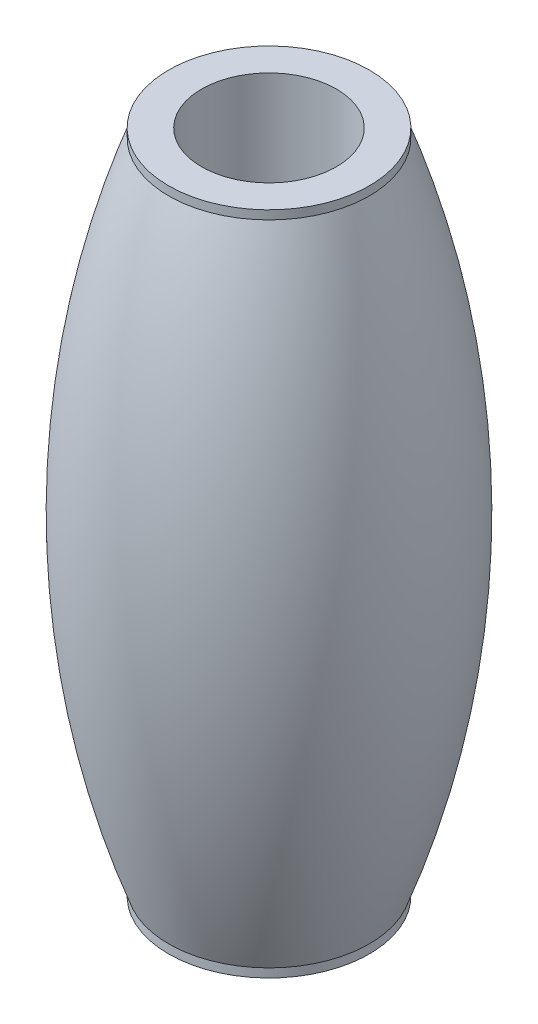
ISO-10303-21;
HEADER;
FILE_DESCRIPTION(('STEP AP214'),'2;1');
FILE_NAME('part.step','',(''),(''),'','','');
FILE_SCHEMA(('AUTOMOTIVE_DESIGN { 1 0 10303 214 1 1 1 1 }'));
ENDSEC;
DATA;
#1=APPLICATION_CONTEXT('core data for automotive mechanical design processes');
#2=APPLICATION_PROTOCOL_DEFINITION('international standard','automotive_design',2000,#1);
#3=PRODUCT_CONTEXT('',#1,'mechanical');
#4=PRODUCT('Part','Part','',(#3));
#5=PRODUCT_RELATED_PRODUCT_CATEGORY('part','',(#4));
#6=PRODUCT_DEFINITION_FORMATION('','',#4);
#7=PRODUCT_DEFINITION_CONTEXT('part definition',#1,'design');
#8=PRODUCT_DEFINITION('design','',#6,#7);
#9=PRODUCT_DEFINITION_SHAPE('','',#8);
#10=(LENGTH_UNIT() NAMED_UNIT(*) SI_UNIT(.MILLI.,.METRE.));
#11=(NAMED_UNIT(*) PLANE_ANGLE_UNIT() SI_UNIT($,.RADIAN.));
#12=(NAMED_UNIT(*) SI_UNIT($,.STERADIAN.) SOLID_ANGLE_UNIT());
#13=UNCERTAINTY_MEASURE_WITH_UNIT(LENGTH_MEASURE(1.E-05),#10,'distance_accuracy_value','');
#14=(GEOMETRIC_REPRESENTATION_CONTEXT(3) GLOBAL_UNCERTAINTY_ASSIGNED_CONTEXT((#13)) GLOBAL_UNIT_ASSIGNED_CONTEXT((#10,
#11,#12)) REPRESENTATION_CONTEXT('',''));
#15=CARTESIAN_POINT('',(0.,0.,0.));
#16=DIRECTION('',(0.,0.,1.));
#17=DIRECTION('',(1.,0.,0.));
#18=AXIS2_PLACEMENT_3D('',#15,#16,#17);
#19=CARTESIAN_POINT('',(22.5,0.,0.));
#20=DIRECTION('',(0.,-1.,0.));
#21=DIRECTION('',(0.,0.,-1.));
#22=AXIS2_PLACEMENT_3D('',#19,#20,#21);
#23=CYLINDRICAL_SURFACE('',#22,1.925);
#24=CARTESIAN_POINT('',(22.5,-9.5,0.));
#25=DIRECTION('',(0.,-1.,0.));
#26=DIRECTION('',(0.,0.,-1.));
#27=AXIS2_PLACEMENT_3D('',#24,#25,#26);
#28=CIRCLE('',#27,1.925);
#29=CARTESIAN_POINT('',(22.5,-9.5,-1.925));
#30=VERTEX_POINT('',#29);
#31=EDGE_CURVE('E32',#30,#30,#28,.F.);
#32=ORIENTED_EDGE('',*,*,#31,.F.);
#33=EDGE_LOOP('',(#32));
#34=FACE_BOUND('',#33,.T.);
#35=CARTESIAN_POINT('',(22.5,9.5,0.));
#36=DIRECTION('',(0.,-1.,0.));
#37=DIRECTION('',(0.,0.,-1.));
#38=AXIS2_PLACEMENT_3D('',#35,#36,#37);
#39=CIRCLE('',#38,1.925);
#40=CARTESIAN_POINT('',(22.5,9.5,-1.925));
#41=VERTEX_POINT('',#40);
#42=EDGE_CURVE('E29',#41,#41,#39,.F.);
#43=ORIENTED_EDGE('',*,*,#42,.T.);
#44=EDGE_LOOP('',(#43));
#45=FACE_BOUND('',#44,.T.);
#46=ADVANCED_FACE('F14',(#34,#45),#23,.F.);
#47=CARTESIAN_POINT('',(22.5,9.5,0.));
#48=DIRECTION('',(0.,-1.,0.));
#49=DIRECTION('',(0.,0.,-1.));
#50=AXIS2_PLACEMENT_3D('',#47,#48,#49);
#51=PLANE('',#50);
#52=ORIENTED_EDGE('',*,*,#42,.F.);
#53=EDGE_LOOP('',(#52));
#54=FACE_BOUND('',#53,.T.);
#55=CARTESIAN_POINT('',(22.5,9.5,0.));
#56=DIRECTION('',(0.,-1.,0.));
#57=DIRECTION('',(0.,0.,-1.));
#58=AXIS2_PLACEMENT_3D('',#55,#56,#57);
#59=CIRCLE('',#58,2.86606985719299);
#60=CARTESIAN_POINT('',(22.5,9.5,-2.86606985719299));
#61=VERTEX_POINT('',#60);
#62=EDGE_CURVE('E35',#61,#61,#59,.T.);
#63=ORIENTED_EDGE('',*,*,#62,.F.);
#64=EDGE_LOOP('',(#63));
#65=FACE_BOUND('',#64,.T.);
#66=ADVANCED_FACE('F46',(#54,#65),#51,.F.);
#67=CARTESIAN_POINT('',(22.5,-9.5,0.));
#68=DIRECTION('',(0.,-1.,0.));
#69=DIRECTION('',(0.,0.,-1.));
#70=AXIS2_PLACEMENT_3D('',#67,#68,#69);
#71=PLANE('',#70);
#72=ORIENTED_EDGE('',*,*,#31,.T.);
#73=EDGE_LOOP('',(#72));
#74=FACE_BOUND('',#73,.T.);
#75=CARTESIAN_POINT('',(22.5,-9.5,0.));
#76=DIRECTION('',(0.,-1.,0.));
#77=DIRECTION('',(0.,0.,-1.));
#78=AXIS2_PLACEMENT_3D('',#75,#76,#77);
#79=CIRCLE('',#78,2.86606985719299);
#80=CARTESIAN_POINT('',(22.5,-9.5,-2.86606985719299));
#81=VERTEX_POINT('',#80);
#82=EDGE_CURVE('E26',#81,#81,#79,.F.);
#83=ORIENTED_EDGE('',*,*,#82,.F.);
#84=EDGE_LOOP('',(#83));
#85=FACE_BOUND('',#84,.T.);
#86=ADVANCED_FACE('F43',(#74,#85),#71,.T.);
#87=CARTESIAN_POINT('',(22.5,0.,0.));
#88=DIRECTION('',(0.,-1.,0.));
#89=DIRECTION('',(0.,0.,-1.));
#90=AXIS2_PLACEMENT_3D('',#87,#88,#89);
#91=CYLINDRICAL_SURFACE('',#90,2.86606985719299);
#92=ORIENTED_EDGE('',*,*,#62,.T.);
#93=EDGE_LOOP('',(#92));
#94=FACE_BOUND('',#93,.T.);
#95=CARTESIAN_POINT('',(22.5,9.25000000000118,-5.95437354078146E-12));
#96=DIRECTION('',(0.,1.,0.));
#97=DIRECTION('',(-1.,0.,0.));
#98=AXIS2_PLACEMENT_3D('',#95,#96,#97);
#99=CIRCLE('',#98,2.86606985719079);
#100=CARTESIAN_POINT('',(19.6339301428092,9.25000000000118,-5.95430875027252E-12));
#101=VERTEX_POINT('',#100);
#102=EDGE_CURVE('E10',#101,#101,#99,.T.);
#103=ORIENTED_EDGE('',*,*,#102,.T.);
#104=EDGE_LOOP('',(#103));
#105=FACE_BOUND('',#104,.T.);
#106=ADVANCED_FACE('F45',(#94,#105),#91,.T.);
#107=CARTESIAN_POINT('',(22.5,0.,0.));
#108=DIRECTION('',(0.,-1.,0.));
#109=DIRECTION('',(0.,0.,-1.));
#110=AXIS2_PLACEMENT_3D('',#107,#108,#109);
#111=CYLINDRICAL_SURFACE('',#110,2.86606985719299);
#112=CARTESIAN_POINT('',(22.5,-9.2500000000012,-5.9935344000088E-12));
#113=DIRECTION('',(0.,-1.,0.));
#114=DIRECTION('',(-1.,0.,0.));
#115=AXIS2_PLACEMENT_3D('',#112,#113,#114);
#116=CIRCLE('',#115,2.86606985719077);
#117=CARTESIAN_POINT('',(19.6339301428092,-9.25000000000118,-5.99012974356578E-12));
#118=VERTEX_POINT('',#117);
#119=EDGE_CURVE('E22',#118,#118,#116,.T.);
#120=ORIENTED_EDGE('',*,*,#119,.T.);
#121=EDGE_LOOP('',(#120));
#122=FACE_BOUND('',#121,.T.);
#123=ORIENTED_EDGE('',*,*,#82,.T.);
#124=EDGE_LOOP('',(#123));
#125=FACE_BOUND('',#124,.T.);
#126=ADVANCED_FACE('F41',(#122,#125),#111,.T.);
#127=CARTESIAN_POINT('',(22.5,0.,-5.95437354078146E-12));
#128=DIRECTION('',(0.,-1.,0.));
#129=DIRECTION('',(0.,0.,-1.));
#130=AXIS2_PLACEMENT_3D('',#127,#128,#129);
#131=DEGENERATE_TOROIDAL_SURFACE('',#130,22.4999999999381,26.9999999999401,.F.);
#132=ORIENTED_EDGE('',*,*,#102,.F.);
#133=EDGE_LOOP('',(#132));
#134=FACE_BOUND('',#133,.T.);
#135=ORIENTED_EDGE('',*,*,#119,.F.);
#136=EDGE_LOOP('',(#135));
#137=FACE_BOUND('',#136,.T.);
#138=ADVANCED_FACE('F16',(#134,#137),#131,.F.);
#139=CLOSED_SHELL('',(#46,#66,#86,#106,#126,#138));
#140=MANIFOLD_SOLID_BREP('B1',#139);
#141=ADVANCED_BREP_SHAPE_REPRESENTATION('',(#18,#140),#14);
#142=SHAPE_DEFINITION_REPRESENTATION(#9,#141);
ENDSEC;
END-ISO-10303-21;
